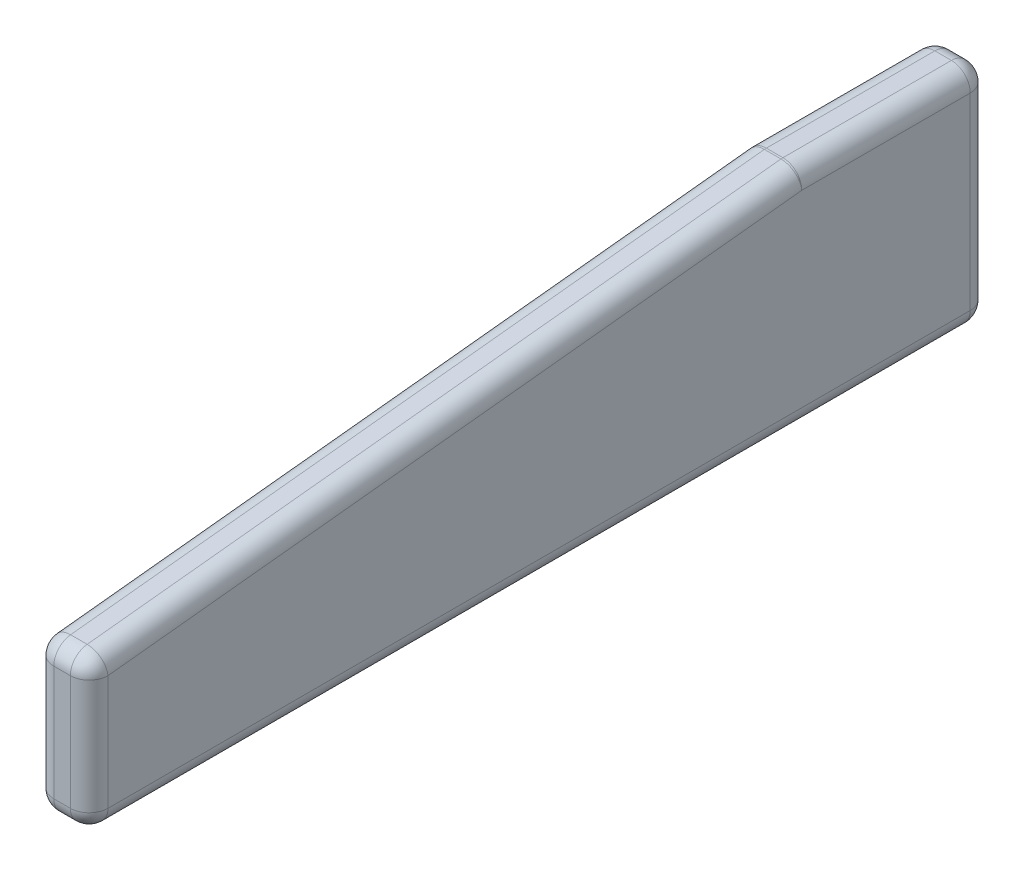
ISO-10303-21;
HEADER;
FILE_DESCRIPTION(('STEP AP214'),'2;1');
FILE_NAME('part.step','',(''),(''),'','','');
FILE_SCHEMA(('AUTOMOTIVE_DESIGN { 1 0 10303 214 1 1 1 1 }'));
ENDSEC;
DATA;
#1=APPLICATION_CONTEXT('core data for automotive mechanical design processes');
#2=APPLICATION_PROTOCOL_DEFINITION('international standard','automotive_design',2000,#1);
#3=PRODUCT_CONTEXT('',#1,'mechanical');
#4=PRODUCT('Part','Part','',(#3));
#5=PRODUCT_RELATED_PRODUCT_CATEGORY('part','',(#4));
#6=PRODUCT_DEFINITION_FORMATION('','',#4);
#7=PRODUCT_DEFINITION_CONTEXT('part definition',#1,'design');
#8=PRODUCT_DEFINITION('design','',#6,#7);
#9=PRODUCT_DEFINITION_SHAPE('','',#8);
#10=(LENGTH_UNIT() NAMED_UNIT(*) SI_UNIT(.MILLI.,.METRE.));
#11=(NAMED_UNIT(*) PLANE_ANGLE_UNIT() SI_UNIT($,.RADIAN.));
#12=(NAMED_UNIT(*) SI_UNIT($,.STERADIAN.) SOLID_ANGLE_UNIT());
#13=UNCERTAINTY_MEASURE_WITH_UNIT(LENGTH_MEASURE(1.E-05),#10,'distance_accuracy_value','');
#14=(GEOMETRIC_REPRESENTATION_CONTEXT(3) GLOBAL_UNCERTAINTY_ASSIGNED_CONTEXT((#13)) GLOBAL_UNIT_ASSIGNED_CONTEXT((#10,
#11,#12)) REPRESENTATION_CONTEXT('',''));
#15=CARTESIAN_POINT('',(0.,0.,0.));
#16=DIRECTION('',(0.,0.,1.));
#17=DIRECTION('',(1.,0.,0.));
#18=AXIS2_PLACEMENT_3D('',#15,#16,#17);
#19=CARTESIAN_POINT('',(18.288,12.2037693458045,-66.9711017356004));
#20=DIRECTION('',(-1.,0.,0.));
#21=DIRECTION('',(0.,0.,1.));
#22=AXIS2_PLACEMENT_3D('',#19,#20,#21);
#23=CYLINDRICAL_SURFACE('',#22,6.35);
#24=DIRECTION('',(-1.,0.,0.));
#25=VECTOR('',#24,1.);
#26=CARTESIAN_POINT('',(18.288,18.5537693458045,-66.9711017356004));
#27=LINE('',#26,#25);
#28=CARTESIAN_POINT('',(11.938,18.5537693458045,-66.9711017356004));
#29=VERTEX_POINT('',#28);
#30=CARTESIAN_POINT('',(6.35,18.5537693458045,-66.9711017356004));
#31=VERTEX_POINT('',#30);
#32=EDGE_CURVE('E147',#29,#31,#27,.T.);
#33=ORIENTED_EDGE('',*,*,#32,.T.);
#34=CARTESIAN_POINT('',(6.35,12.2037693458045,-66.9711017356004));
#35=DIRECTION('',(-1.,0.,0.));
#36=DIRECTION('',(0.,0.,1.));
#37=AXIS2_PLACEMENT_3D('',#34,#35,#36);
#38=CIRCLE('',#37,6.35);
#39=CARTESIAN_POINT('',(6.35,18.5184912950592,-66.3026806829688));
#40=VERTEX_POINT('',#39);
#41=EDGE_CURVE('E247',#31,#40,#38,.F.);
#42=ORIENTED_EDGE('',*,*,#41,.T.);
#43=DIRECTION('',(-1.,0.,0.));
#44=VECTOR('',#43,1.);
#45=CARTESIAN_POINT('',(18.288,18.5184912950592,-66.3026806829688));
#46=LINE('',#45,#44);
#47=CARTESIAN_POINT('',(11.938,18.5184912950592,-66.3026806829688));
#48=VERTEX_POINT('',#47);
#49=EDGE_CURVE('E170',#48,#40,#46,.T.);
#50=ORIENTED_EDGE('',*,*,#49,.F.);
#51=CARTESIAN_POINT('',(11.938,12.2037693458045,-66.9711017356004));
#52=DIRECTION('',(-1.,0.,0.));
#53=DIRECTION('',(0.,0.,1.));
#54=AXIS2_PLACEMENT_3D('',#51,#52,#53);
#55=CIRCLE('',#54,6.35);
#56=EDGE_CURVE('E237',#48,#29,#55,.T.);
#57=ORIENTED_EDGE('',*,*,#56,.T.);
#58=EDGE_LOOP('',(#33,#42,#50,#57));
#59=FACE_BOUND('',#58,.T.);
#60=ADVANCED_FACE('F34',(#59),#23,.T.);
#61=CARTESIAN_POINT('',(18.288,18.5184912950592,-66.3026806829688));
#62=DIRECTION('',(0.,-0.994444401457431,-0.105263157894737));
#63=DIRECTION('',(0.,0.105263157894737,-0.994444401457431));
#64=AXIS2_PLACEMENT_3D('',#61,#62,#63);
#65=PLANE('',#64);
#66=ORIENTED_EDGE('',*,*,#49,.T.);
#67=DIRECTION('',(0.,-0.105263157894737,0.994444401457431));
#68=VECTOR('',#67,1.);
#69=CARTESIAN_POINT('',(6.35,-6.24482856379033,167.64189487079));
#70=LINE('',#69,#68);
#71=CARTESIAN_POINT('',(6.35,-6.24482856379033,167.64189487079));
#72=VERTEX_POINT('',#71);
#73=EDGE_CURVE('E257',#40,#72,#70,.T.);
#74=ORIENTED_EDGE('',*,*,#73,.T.);
#75=DIRECTION('',(-1.,0.,0.));
#76=VECTOR('',#75,1.);
#77=CARTESIAN_POINT('',(18.288,-6.24482856379033,167.64189487079));
#78=LINE('',#77,#76);
#79=CARTESIAN_POINT('',(11.938,-6.24482856379033,167.64189487079));
#80=VERTEX_POINT('',#79);
#81=EDGE_CURVE('E299',#80,#72,#78,.T.);
#82=ORIENTED_EDGE('',*,*,#81,.F.);
#83=DIRECTION('',(0.,-0.105263157894737,0.994444401457431));
#84=VECTOR('',#83,1.);
#85=CARTESIAN_POINT('',(11.938,18.5184912950592,-66.3026806829688));
#86=LINE('',#85,#84);
#87=EDGE_CURVE('E259',#80,#48,#86,.F.);
#88=ORIENTED_EDGE('',*,*,#87,.T.);
#89=EDGE_LOOP('',(#66,#74,#82,#88));
#90=FACE_BOUND('',#89,.T.);
#91=ADVANCED_FACE('F349',(#90),#65,.F.);
#92=CARTESIAN_POINT('',(18.288,-12.559550513045,166.973473818158));
#93=DIRECTION('',(-1.,0.,0.));
#94=DIRECTION('',(0.,0.,1.));
#95=AXIS2_PLACEMENT_3D('',#92,#93,#94);
#96=CYLINDRICAL_SURFACE('',#95,6.35);
#97=ORIENTED_EDGE('',*,*,#81,.T.);
#98=CARTESIAN_POINT('',(6.35,-12.559550513045,166.973473818158));
#99=DIRECTION('',(-1.,0.,0.));
#100=DIRECTION('',(0.,0.,1.));
#101=AXIS2_PLACEMENT_3D('',#98,#99,#100);
#102=CIRCLE('',#101,6.35);
#103=CARTESIAN_POINT('',(6.35,-12.5595505130451,173.323473818158));
#104=VERTEX_POINT('',#103);
#105=EDGE_CURVE('E261',#72,#104,#102,.F.);
#106=ORIENTED_EDGE('',*,*,#105,.T.);
#107=DIRECTION('',(-1.,0.,0.));
#108=VECTOR('',#107,1.);
#109=CARTESIAN_POINT('',(18.288,-12.5595505130451,173.323473818158));
#110=LINE('',#109,#108);
#111=CARTESIAN_POINT('',(11.938,-12.5595505130451,173.323473818158));
#112=VERTEX_POINT('',#111);
#113=EDGE_CURVE('E302',#112,#104,#110,.T.);
#114=ORIENTED_EDGE('',*,*,#113,.F.);
#115=CARTESIAN_POINT('',(11.938,-12.559550513045,166.973473818158));
#116=DIRECTION('',(-1.,0.,0.));
#117=DIRECTION('',(0.,0.,1.));
#118=AXIS2_PLACEMENT_3D('',#115,#116,#117);
#119=CIRCLE('',#118,6.35);
#120=EDGE_CURVE('E263',#112,#80,#119,.T.);
#121=ORIENTED_EDGE('',*,*,#120,.T.);
#122=EDGE_LOOP('',(#97,#106,#114,#121));
#123=FACE_BOUND('',#122,.T.);
#124=ADVANCED_FACE('F353',(#123),#96,.T.);
#125=CARTESIAN_POINT('',(18.288,-12.5595505130451,173.323473818158));
#126=DIRECTION('',(0.,0.,-1.));
#127=DIRECTION('',(-1.,0.,0.));
#128=AXIS2_PLACEMENT_3D('',#125,#126,#127);
#129=PLANE('',#128);
#130=ORIENTED_EDGE('',*,*,#113,.T.);
#131=DIRECTION('',(0.,-1.,0.));
#132=VECTOR('',#131,1.);
#133=CARTESIAN_POINT('',(6.35,-51.2962306541955,173.323473818158));
#134=LINE('',#133,#132);
#135=CARTESIAN_POINT('',(6.35,-51.2962306541955,173.323473818158));
#136=VERTEX_POINT('',#135);
#137=EDGE_CURVE('E265',#104,#136,#134,.T.);
#138=ORIENTED_EDGE('',*,*,#137,.T.);
#139=DIRECTION('',(-1.,0.,0.));
#140=VECTOR('',#139,1.);
#141=CARTESIAN_POINT('',(18.288,-51.2962306541955,173.323473818158));
#142=LINE('',#141,#140);
#143=CARTESIAN_POINT('',(11.938,-51.2962306541955,173.323473818158));
#144=VERTEX_POINT('',#143);
#145=EDGE_CURVE('E305',#144,#136,#142,.T.);
#146=ORIENTED_EDGE('',*,*,#145,.F.);
#147=DIRECTION('',(0.,-1.,0.));
#148=VECTOR('',#147,1.);
#149=CARTESIAN_POINT('',(11.938,-12.5595505130451,173.323473818158));
#150=LINE('',#149,#148);
#151=EDGE_CURVE('E267',#144,#112,#150,.F.);
#152=ORIENTED_EDGE('',*,*,#151,.T.);
#153=EDGE_LOOP('',(#130,#138,#146,#152));
#154=FACE_BOUND('',#153,.T.);
#155=ADVANCED_FACE('F359',(#154),#129,.F.);
#156=CARTESIAN_POINT('',(18.288,-51.2962306541955,166.973473818158));
#157=DIRECTION('',(-1.,0.,0.));
#158=DIRECTION('',(0.,0.,1.));
#159=AXIS2_PLACEMENT_3D('',#156,#157,#158);
#160=CYLINDRICAL_SURFACE('',#159,6.35);
#161=ORIENTED_EDGE('',*,*,#145,.T.);
#162=CARTESIAN_POINT('',(6.35,-51.2962306541955,166.973473818158));
#163=DIRECTION('',(-1.,0.,0.));
#164=DIRECTION('',(0.,0.,1.));
#165=AXIS2_PLACEMENT_3D('',#162,#163,#164);
#166=CIRCLE('',#165,6.35);
#167=CARTESIAN_POINT('',(6.35,-57.6462306541955,166.973473818158));
#168=VERTEX_POINT('',#167);
#169=EDGE_CURVE('E269',#136,#168,#166,.F.);
#170=ORIENTED_EDGE('',*,*,#169,.T.);
#171=DIRECTION('',(-1.,0.,0.));
#172=VECTOR('',#171,1.);
#173=CARTESIAN_POINT('',(18.288,-57.6462306541955,166.973473818158));
#174=LINE('',#173,#172);
#175=CARTESIAN_POINT('',(11.938,-57.6462306541955,166.973473818158));
#176=VERTEX_POINT('',#175);
#177=EDGE_CURVE('E308',#176,#168,#174,.T.);
#178=ORIENTED_EDGE('',*,*,#177,.F.);
#179=CARTESIAN_POINT('',(11.938,-51.2962306541955,166.973473818158));
#180=DIRECTION('',(-1.,0.,0.));
#181=DIRECTION('',(0.,0.,1.));
#182=AXIS2_PLACEMENT_3D('',#179,#180,#181);
#183=CIRCLE('',#182,6.35);
#184=EDGE_CURVE('E271',#176,#144,#183,.T.);
#185=ORIENTED_EDGE('',*,*,#184,.T.);
#186=EDGE_LOOP('',(#161,#170,#178,#185));
#187=FACE_BOUND('',#186,.T.);
#188=ADVANCED_FACE('F363',(#187),#160,.T.);
#189=CARTESIAN_POINT('',(18.288,-57.6462306541955,166.973473818158));
#190=DIRECTION('',(0.,1.,0.));
#191=DIRECTION('',(0.,0.,1.));
#192=AXIS2_PLACEMENT_3D('',#189,#190,#191);
#193=PLANE('',#192);
#194=ORIENTED_EDGE('',*,*,#177,.T.);
#195=DIRECTION('',(0.,0.,-1.));
#196=VECTOR('',#195,1.);
#197=CARTESIAN_POINT('',(6.35,-57.6462306541955,-123.78596025352));
#198=LINE('',#197,#196);
#199=CARTESIAN_POINT('',(6.35,-57.6462306541955,-123.78596025352));
#200=VERTEX_POINT('',#199);
#201=EDGE_CURVE('E273',#168,#200,#198,.T.);
#202=ORIENTED_EDGE('',*,*,#201,.T.);
#203=DIRECTION('',(-1.,0.,0.));
#204=VECTOR('',#203,1.);
#205=CARTESIAN_POINT('',(18.288,-57.6462306541955,-123.78596025352));
#206=LINE('',#205,#204);
#207=CARTESIAN_POINT('',(11.938,-57.6462306541955,-123.78596025352));
#208=VERTEX_POINT('',#207);
#209=EDGE_CURVE('E311',#208,#200,#206,.T.);
#210=ORIENTED_EDGE('',*,*,#209,.F.);
#211=DIRECTION('',(0.,0.,-1.));
#212=VECTOR('',#211,1.);
#213=CARTESIAN_POINT('',(11.938,-57.6462306541955,166.973473818158));
#214=LINE('',#213,#212);
#215=EDGE_CURVE('E275',#208,#176,#214,.F.);
#216=ORIENTED_EDGE('',*,*,#215,.T.);
#217=EDGE_LOOP('',(#194,#202,#210,#216));
#218=FACE_BOUND('',#217,.T.);
#219=ADVANCED_FACE('F367',(#218),#193,.F.);
#220=CARTESIAN_POINT('',(18.288,-51.2962306541955,-123.78596025352));
#221=DIRECTION('',(-1.,0.,0.));
#222=DIRECTION('',(0.,0.,1.));
#223=AXIS2_PLACEMENT_3D('',#220,#221,#222);
#224=CYLINDRICAL_SURFACE('',#223,6.34999999999999);
#225=ORIENTED_EDGE('',*,*,#209,.T.);
#226=CARTESIAN_POINT('',(6.35,-51.2962306541955,-123.78596025352));
#227=DIRECTION('',(-1.,0.,0.));
#228=DIRECTION('',(0.,0.,1.));
#229=AXIS2_PLACEMENT_3D('',#226,#227,#228);
#230=CIRCLE('',#229,6.34999999999999);
#231=CARTESIAN_POINT('',(6.35,-51.2962306541954,-130.13596025352));
#232=VERTEX_POINT('',#231);
#233=EDGE_CURVE('E277',#200,#232,#230,.F.);
#234=ORIENTED_EDGE('',*,*,#233,.T.);
#235=DIRECTION('',(-1.,0.,0.));
#236=VECTOR('',#235,1.);
#237=CARTESIAN_POINT('',(18.288,-51.2962306541954,-130.13596025352));
#238=LINE('',#237,#236);
#239=CARTESIAN_POINT('',(11.938,-51.2962306541954,-130.13596025352));
#240=VERTEX_POINT('',#239);
#241=EDGE_CURVE('E314',#240,#232,#238,.T.);
#242=ORIENTED_EDGE('',*,*,#241,.F.);
#243=CARTESIAN_POINT('',(11.938,-51.2962306541955,-123.78596025352));
#244=DIRECTION('',(-1.,0.,0.));
#245=DIRECTION('',(0.,0.,1.));
#246=AXIS2_PLACEMENT_3D('',#243,#244,#245);
#247=CIRCLE('',#246,6.34999999999999);
#248=EDGE_CURVE('E279',#240,#208,#247,.T.);
#249=ORIENTED_EDGE('',*,*,#248,.T.);
#250=EDGE_LOOP('',(#225,#234,#242,#249));
#251=FACE_BOUND('',#250,.T.);
#252=ADVANCED_FACE('F371',(#251),#224,.T.);
#253=CARTESIAN_POINT('',(18.288,-51.2962306541954,-130.13596025352));
#254=DIRECTION('',(0.,0.,1.));
#255=DIRECTION('',(1.,0.,0.));
#256=AXIS2_PLACEMENT_3D('',#253,#254,#255);
#257=PLANE('',#256);
#258=ORIENTED_EDGE('',*,*,#241,.T.);
#259=DIRECTION('',(0.,1.,0.));
#260=VECTOR('',#259,1.);
#261=CARTESIAN_POINT('',(6.35,12.2037693458045,-130.13596025352));
#262=LINE('',#261,#260);
#263=CARTESIAN_POINT('',(6.35,12.2037693458045,-130.13596025352));
#264=VERTEX_POINT('',#263);
#265=EDGE_CURVE('E292',#232,#264,#262,.T.);
#266=ORIENTED_EDGE('',*,*,#265,.T.);
#267=DIRECTION('',(-1.,0.,0.));
#268=VECTOR('',#267,1.);
#269=CARTESIAN_POINT('',(18.288,12.2037693458045,-130.13596025352));
#270=LINE('',#269,#268);
#271=CARTESIAN_POINT('',(11.938,12.2037693458045,-130.13596025352));
#272=VERTEX_POINT('',#271);
#273=EDGE_CURVE('E161',#272,#264,#270,.T.);
#274=ORIENTED_EDGE('',*,*,#273,.F.);
#275=DIRECTION('',(0.,1.,0.));
#276=VECTOR('',#275,1.);
#277=CARTESIAN_POINT('',(11.938,-51.2962306541954,-130.13596025352));
#278=LINE('',#277,#276);
#279=EDGE_CURVE('E294',#272,#240,#278,.F.);
#280=ORIENTED_EDGE('',*,*,#279,.T.);
#281=EDGE_LOOP('',(#258,#266,#274,#280));
#282=FACE_BOUND('',#281,.T.);
#283=ADVANCED_FACE('F375',(#282),#257,.F.);
#284=CARTESIAN_POINT('',(18.288,12.2037693458045,-123.78596025352));
#285=DIRECTION('',(-1.,0.,0.));
#286=DIRECTION('',(0.,0.,1.));
#287=AXIS2_PLACEMENT_3D('',#284,#285,#286);
#288=CYLINDRICAL_SURFACE('',#287,6.35);
#289=ORIENTED_EDGE('',*,*,#273,.T.);
#290=CARTESIAN_POINT('',(6.35,12.2037693458045,-123.78596025352));
#291=DIRECTION('',(-1.,0.,0.));
#292=DIRECTION('',(0.,0.,1.));
#293=AXIS2_PLACEMENT_3D('',#290,#291,#292);
#294=CIRCLE('',#293,6.35);
#295=CARTESIAN_POINT('',(6.35,18.5537693458045,-123.78596025352));
#296=VERTEX_POINT('',#295);
#297=EDGE_CURVE('E160',#264,#296,#294,.F.);
#298=ORIENTED_EDGE('',*,*,#297,.T.);
#299=DIRECTION('',(-1.,0.,0.));
#300=VECTOR('',#299,1.);
#301=CARTESIAN_POINT('',(18.288,18.5537693458045,-123.78596025352));
#302=LINE('',#301,#300);
#303=CARTESIAN_POINT('',(11.938,18.5537693458045,-123.78596025352));
#304=VERTEX_POINT('',#303);
#305=EDGE_CURVE('E145',#304,#296,#302,.T.);
#306=ORIENTED_EDGE('',*,*,#305,.F.);
#307=CARTESIAN_POINT('',(11.938,12.2037693458045,-123.78596025352));
#308=DIRECTION('',(-1.,0.,0.));
#309=DIRECTION('',(0.,0.,1.));
#310=AXIS2_PLACEMENT_3D('',#307,#308,#309);
#311=CIRCLE('',#310,6.35);
#312=EDGE_CURVE('E157',#304,#272,#311,.T.);
#313=ORIENTED_EDGE('',*,*,#312,.T.);
#314=EDGE_LOOP('',(#289,#298,#306,#313));
#315=FACE_BOUND('',#314,.T.);
#316=ADVANCED_FACE('F156',(#315),#288,.T.);
#317=CARTESIAN_POINT('',(18.288,18.5537693458045,-123.78596025352));
#318=DIRECTION('',(0.,-1.,0.));
#319=DIRECTION('',(0.,0.,-1.));
#320=AXIS2_PLACEMENT_3D('',#317,#318,#319);
#321=PLANE('',#320);
#322=ORIENTED_EDGE('',*,*,#32,.F.);
#323=DIRECTION('',(0.,0.,1.));
#324=VECTOR('',#323,1.);
#325=CARTESIAN_POINT('',(11.938,18.5537693458045,-123.78596025352));
#326=LINE('',#325,#324);
#327=EDGE_CURVE('E11',#29,#304,#326,.F.);
#328=ORIENTED_EDGE('',*,*,#327,.T.);
#329=ORIENTED_EDGE('',*,*,#305,.T.);
#330=DIRECTION('',(0.,0.,1.));
#331=VECTOR('',#330,1.);
#332=CARTESIAN_POINT('',(6.35,18.5537693458045,-66.9711017356004));
#333=LINE('',#332,#331);
#334=EDGE_CURVE('E43',#296,#31,#333,.T.);
#335=ORIENTED_EDGE('',*,*,#334,.T.);
#336=EDGE_LOOP('',(#322,#328,#329,#335));
#337=FACE_BOUND('',#336,.T.);
#338=ADVANCED_FACE('F144',(#337),#321,.F.);
#339=CARTESIAN_POINT('',(18.288,12.2037693458045,-66.9711017356004));
#340=DIRECTION('',(-1.,0.,0.));
#341=DIRECTION('',(0.,0.,1.));
#342=AXIS2_PLACEMENT_3D('',#339,#340,#341);
#343=PLANE('',#342);
#344=DIRECTION('',(0.,1.,0.));
#345=VECTOR('',#344,1.);
#346=CARTESIAN_POINT('',(18.288,12.2037693458045,-123.78596025352));
#347=LINE('',#346,#345);
#348=CARTESIAN_POINT('',(18.288,-51.2962306541955,-123.78596025352));
#349=VERTEX_POINT('',#348);
#350=CARTESIAN_POINT('',(18.288,12.2037693458045,-123.78596025352));
#351=VERTEX_POINT('',#350);
#352=EDGE_CURVE('E51',#349,#351,#347,.T.);
#353=ORIENTED_EDGE('',*,*,#352,.T.);
#354=DIRECTION('',(0.,0.,1.));
#355=VECTOR('',#354,1.);
#356=CARTESIAN_POINT('',(18.288,12.2037693458045,-66.9711017356004));
#357=LINE('',#356,#355);
#358=CARTESIAN_POINT('',(18.288,12.2037693458045,-66.9711017356004));
#359=VERTEX_POINT('',#358);
#360=EDGE_CURVE('E173',#351,#359,#357,.T.);
#361=ORIENTED_EDGE('',*,*,#360,.T.);
#362=DIRECTION('',(0.,-0.105263157894737,0.994444401457431));
#363=VECTOR('',#362,1.);
#364=CARTESIAN_POINT('',(18.288,12.2037693458045,-66.9711017356004));
#365=LINE('',#364,#363);
#366=CARTESIAN_POINT('',(18.288,-12.559550513045,166.973473818158));
#367=VERTEX_POINT('',#366);
#368=EDGE_CURVE('E241',#359,#367,#365,.T.);
#369=ORIENTED_EDGE('',*,*,#368,.T.);
#370=DIRECTION('',(0.,-1.,0.));
#371=VECTOR('',#370,1.);
#372=CARTESIAN_POINT('',(18.288,12.2037693458045,166.973473818158));
#373=LINE('',#372,#371);
#374=CARTESIAN_POINT('',(18.288,-51.2962306541955,166.973473818158));
#375=VERTEX_POINT('',#374);
#376=EDGE_CURVE('E246',#367,#375,#373,.T.);
#377=ORIENTED_EDGE('',*,*,#376,.T.);
#378=DIRECTION('',(0.,0.,-1.));
#379=VECTOR('',#378,1.);
#380=CARTESIAN_POINT('',(18.288,-51.2962306541955,-66.9711017356004));
#381=LINE('',#380,#379);
#382=EDGE_CURVE('E56',#375,#349,#381,.T.);
#383=ORIENTED_EDGE('',*,*,#382,.T.);
#384=EDGE_LOOP('',(#353,#361,#369,#377,#383));
#385=FACE_BOUND('',#384,.T.);
#386=ADVANCED_FACE('F249',(#385),#343,.F.);
#387=CARTESIAN_POINT('',(0.,12.2037693458045,-66.9711017356004));
#388=DIRECTION('',(-1.,0.,0.));
#389=DIRECTION('',(0.,0.,1.));
#390=AXIS2_PLACEMENT_3D('',#387,#388,#389);
#391=PLANE('',#390);
#392=DIRECTION('',(0.,0.,1.));
#393=VECTOR('',#392,1.);
#394=CARTESIAN_POINT('',(0.,12.2037693458045,-123.78596025352));
#395=LINE('',#394,#393);
#396=CARTESIAN_POINT('',(0.,12.2037693458045,-66.9711017356004));
#397=VERTEX_POINT('',#396);
#398=CARTESIAN_POINT('',(0.,12.2037693458045,-123.78596025352));
#399=VERTEX_POINT('',#398);
#400=EDGE_CURVE('E290',#397,#399,#395,.F.);
#401=ORIENTED_EDGE('',*,*,#400,.T.);
#402=DIRECTION('',(0.,1.,0.));
#403=VECTOR('',#402,1.);
#404=CARTESIAN_POINT('',(0.,-51.2962306541954,-123.78596025352));
#405=LINE('',#404,#403);
#406=CARTESIAN_POINT('',(0.,-51.2962306541955,-123.78596025352));
#407=VERTEX_POINT('',#406);
#408=EDGE_CURVE('E281',#399,#407,#405,.F.);
#409=ORIENTED_EDGE('',*,*,#408,.T.);
#410=DIRECTION('',(0.,0.,-1.));
#411=VECTOR('',#410,1.);
#412=CARTESIAN_POINT('',(0.,-51.2962306541955,166.973473818158));
#413=LINE('',#412,#411);
#414=CARTESIAN_POINT('',(0.,-51.2962306541955,166.973473818158));
#415=VERTEX_POINT('',#414);
#416=EDGE_CURVE('E284',#407,#415,#413,.F.);
#417=ORIENTED_EDGE('',*,*,#416,.T.);
#418=DIRECTION('',(0.,-1.,0.));
#419=VECTOR('',#418,1.);
#420=CARTESIAN_POINT('',(0.,-12.5595505130451,166.973473818158));
#421=LINE('',#420,#419);
#422=CARTESIAN_POINT('',(0.,-12.559550513045,166.973473818158));
#423=VERTEX_POINT('',#422);
#424=EDGE_CURVE('E286',#415,#423,#421,.F.);
#425=ORIENTED_EDGE('',*,*,#424,.T.);
#426=DIRECTION('',(0.,-0.105263157894737,0.994444401457431));
#427=VECTOR('',#426,1.);
#428=CARTESIAN_POINT('',(0.,12.2037693458045,-66.9711017356003));
#429=LINE('',#428,#427);
#430=EDGE_CURVE('E288',#423,#397,#429,.F.);
#431=ORIENTED_EDGE('',*,*,#430,.T.);
#432=EDGE_LOOP('',(#401,#409,#417,#425,#431));
#433=FACE_BOUND('',#432,.T.);
#434=ADVANCED_FACE('F330',(#433),#391,.T.);
#435=CARTESIAN_POINT('',(6.35,-12.5595505130451,166.973473818158));
#436=DIRECTION('',(0.,1.,0.));
#437=DIRECTION('',(0.,0.,1.));
#438=AXIS2_PLACEMENT_3D('',#435,#436,#437);
#439=CYLINDRICAL_SURFACE('',#438,6.35);
#440=CARTESIAN_POINT('',(6.35,-51.2962306541955,166.973473818158));
#441=DIRECTION('',(0.,-1.,0.));
#442=DIRECTION('',(1.,0.,0.));
#443=AXIS2_PLACEMENT_3D('',#440,#441,#442);
#444=CIRCLE('',#443,6.35);
#445=EDGE_CURVE('E230',#136,#415,#444,.T.);
#446=ORIENTED_EDGE('',*,*,#445,.F.);
#447=ORIENTED_EDGE('',*,*,#137,.F.);
#448=CARTESIAN_POINT('',(6.35,-12.5595505130451,166.973473818158));
#449=DIRECTION('',(0.,1.,0.));
#450=DIRECTION('',(0.,0.,1.));
#451=AXIS2_PLACEMENT_3D('',#448,#449,#450);
#452=CIRCLE('',#451,6.35);
#453=EDGE_CURVE('E227',#423,#104,#452,.T.);
#454=ORIENTED_EDGE('',*,*,#453,.F.);
#455=ORIENTED_EDGE('',*,*,#424,.F.);
#456=EDGE_LOOP('',(#446,#447,#454,#455));
#457=FACE_BOUND('',#456,.T.);
#458=ADVANCED_FACE('F386',(#457),#439,.T.);
#459=CARTESIAN_POINT('',(6.35,-51.2962306541955,166.973473818158));
#460=DIRECTION('',(0.,0.,1.));
#461=DIRECTION('',(1.,0.,0.));
#462=AXIS2_PLACEMENT_3D('',#459,#460,#461);
#463=SPHERICAL_SURFACE('',#462,6.35);
#464=ORIENTED_EDGE('',*,*,#169,.F.);
#465=ORIENTED_EDGE('',*,*,#445,.T.);
#466=CARTESIAN_POINT('',(6.35,-51.2962306541955,166.973473818158));
#467=DIRECTION('',(0.,0.,-1.));
#468=DIRECTION('',(0.,1.,0.));
#469=AXIS2_PLACEMENT_3D('',#466,#467,#468);
#470=CIRCLE('',#469,6.35);
#471=EDGE_CURVE('E224',#168,#415,#470,.T.);
#472=ORIENTED_EDGE('',*,*,#471,.F.);
#473=EDGE_LOOP('',(#464,#465,#472));
#474=FACE_BOUND('',#473,.T.);
#475=ADVANCED_FACE('F402',(#474),#463,.T.);
#476=CARTESIAN_POINT('',(6.35,-12.559550513045,166.973473818158));
#477=DIRECTION('',(0.,0.,1.));
#478=DIRECTION('',(1.,0.,0.));
#479=AXIS2_PLACEMENT_3D('',#476,#477,#478);
#480=SPHERICAL_SURFACE('',#479,6.35);
#481=ORIENTED_EDGE('',*,*,#453,.T.);
#482=ORIENTED_EDGE('',*,*,#105,.F.);
#483=CARTESIAN_POINT('',(6.35,-12.559550513045,166.973473818158));
#484=DIRECTION('',(0.,0.105263157894731,-0.994444401457431));
#485=DIRECTION('',(0.,0.994444401457431,0.105263157894731));
#486=AXIS2_PLACEMENT_3D('',#483,#484,#485);
#487=CIRCLE('',#486,6.35);
#488=EDGE_CURVE('E221',#423,#72,#487,.T.);
#489=ORIENTED_EDGE('',*,*,#488,.F.);
#490=EDGE_LOOP('',(#481,#482,#489));
#491=FACE_BOUND('',#490,.T.);
#492=ADVANCED_FACE('F411',(#491),#480,.T.);
#493=CARTESIAN_POINT('',(6.35,-51.2962306541955,166.973473818158));
#494=DIRECTION('',(0.,0.,1.));
#495=DIRECTION('',(0.,-1.,0.));
#496=AXIS2_PLACEMENT_3D('',#493,#494,#495);
#497=CYLINDRICAL_SURFACE('',#496,6.35);
#498=ORIENTED_EDGE('',*,*,#471,.T.);
#499=ORIENTED_EDGE('',*,*,#416,.F.);
#500=CARTESIAN_POINT('',(6.35,-51.2962306541955,-123.78596025352));
#501=DIRECTION('',(0.,0.,-1.));
#502=DIRECTION('',(-1.,0.,0.));
#503=AXIS2_PLACEMENT_3D('',#500,#501,#502);
#504=CIRCLE('',#503,6.35);
#505=EDGE_CURVE('E218',#200,#407,#504,.T.);
#506=ORIENTED_EDGE('',*,*,#505,.F.);
#507=ORIENTED_EDGE('',*,*,#201,.F.);
#508=EDGE_LOOP('',(#498,#499,#506,#507));
#509=FACE_BOUND('',#508,.T.);
#510=ADVANCED_FACE('F419',(#509),#497,.T.);
#511=CARTESIAN_POINT('',(6.35,12.2037693458045,-66.9711017356003));
#512=DIRECTION('',(0.,0.105263157894737,-0.994444401457431));
#513=DIRECTION('',(0.,0.994444401457431,0.105263157894737));
#514=AXIS2_PLACEMENT_3D('',#511,#512,#513);
#515=CYLINDRICAL_SURFACE('',#514,6.35);
#516=ORIENTED_EDGE('',*,*,#488,.T.);
#517=ORIENTED_EDGE('',*,*,#73,.F.);
#518=CARTESIAN_POINT('',(6.35,12.2037693458045,-66.9711017356003));
#519=DIRECTION('',(0.,0.105263157894737,-0.994444401457431));
#520=DIRECTION('',(0.,0.994444401457431,0.105263157894737));
#521=AXIS2_PLACEMENT_3D('',#518,#519,#520);
#522=CIRCLE('',#521,6.35);
#523=EDGE_CURVE('E215',#397,#40,#522,.T.);
#524=ORIENTED_EDGE('',*,*,#523,.F.);
#525=ORIENTED_EDGE('',*,*,#430,.F.);
#526=EDGE_LOOP('',(#516,#517,#524,#525));
#527=FACE_BOUND('',#526,.T.);
#528=ADVANCED_FACE('F428',(#527),#515,.T.);
#529=CARTESIAN_POINT('',(6.35,-51.2962306541955,-123.78596025352));
#530=DIRECTION('',(0.,0.,1.));
#531=DIRECTION('',(1.,0.,0.));
#532=AXIS2_PLACEMENT_3D('',#529,#530,#531);
#533=SPHERICAL_SURFACE('',#532,6.35);
#534=ORIENTED_EDGE('',*,*,#233,.F.);
#535=ORIENTED_EDGE('',*,*,#505,.T.);
#536=CARTESIAN_POINT('',(6.35,-51.2962306541955,-123.78596025352));
#537=DIRECTION('',(0.,1.,0.));
#538=DIRECTION('',(0.,0.,1.));
#539=AXIS2_PLACEMENT_3D('',#536,#537,#538);
#540=CIRCLE('',#539,6.35);
#541=EDGE_CURVE('E213',#232,#407,#540,.T.);
#542=ORIENTED_EDGE('',*,*,#541,.F.);
#543=EDGE_LOOP('',(#534,#535,#542));
#544=FACE_BOUND('',#543,.T.);
#545=ADVANCED_FACE('F438',(#544),#533,.T.);
#546=CARTESIAN_POINT('',(6.35,12.2037693458045,-66.9711017356004));
#547=DIRECTION('',(0.,0.,1.));
#548=DIRECTION('',(1.,0.,0.));
#549=AXIS2_PLACEMENT_3D('',#546,#547,#548);
#550=SPHERICAL_SURFACE('',#549,6.35);
#551=ORIENTED_EDGE('',*,*,#523,.T.);
#552=ORIENTED_EDGE('',*,*,#41,.F.);
#553=CARTESIAN_POINT('',(6.35,12.2037693458045,-66.9711017356004));
#554=DIRECTION('',(0.,0.,-1.));
#555=DIRECTION('',(0.,1.,0.));
#556=AXIS2_PLACEMENT_3D('',#553,#554,#555);
#557=CIRCLE('',#556,6.35);
#558=EDGE_CURVE('E207',#397,#31,#557,.T.);
#559=ORIENTED_EDGE('',*,*,#558,.F.);
#560=EDGE_LOOP('',(#551,#552,#559));
#561=FACE_BOUND('',#560,.T.);
#562=ADVANCED_FACE('F323',(#561),#550,.T.);
#563=CARTESIAN_POINT('',(6.35,-51.2962306541954,-123.78596025352));
#564=DIRECTION('',(0.,-1.,0.));
#565=DIRECTION('',(0.,0.,-1.));
#566=AXIS2_PLACEMENT_3D('',#563,#564,#565);
#567=CYLINDRICAL_SURFACE('',#566,6.35);
#568=ORIENTED_EDGE('',*,*,#541,.T.);
#569=ORIENTED_EDGE('',*,*,#408,.F.);
#570=CARTESIAN_POINT('',(6.35,12.2037693458045,-123.78596025352));
#571=DIRECTION('',(0.,1.,0.));
#572=DIRECTION('',(-1.,0.,0.));
#573=AXIS2_PLACEMENT_3D('',#570,#571,#572);
#574=CIRCLE('',#573,6.35);
#575=EDGE_CURVE('E201',#264,#399,#574,.T.);
#576=ORIENTED_EDGE('',*,*,#575,.F.);
#577=ORIENTED_EDGE('',*,*,#265,.F.);
#578=EDGE_LOOP('',(#568,#569,#576,#577));
#579=FACE_BOUND('',#578,.T.);
#580=ADVANCED_FACE('F334',(#579),#567,.T.);
#581=CARTESIAN_POINT('',(6.35,12.2037693458045,-123.78596025352));
#582=DIRECTION('',(0.,0.,-1.));
#583=DIRECTION('',(0.,1.,0.));
#584=AXIS2_PLACEMENT_3D('',#581,#582,#583);
#585=CYLINDRICAL_SURFACE('',#584,6.35);
#586=ORIENTED_EDGE('',*,*,#558,.T.);
#587=ORIENTED_EDGE('',*,*,#334,.F.);
#588=CARTESIAN_POINT('',(6.35,12.2037693458045,-123.78596025352));
#589=DIRECTION('',(0.,0.,-1.));
#590=DIRECTION('',(0.,1.,0.));
#591=AXIS2_PLACEMENT_3D('',#588,#589,#590);
#592=CIRCLE('',#591,6.35);
#593=EDGE_CURVE('E197',#399,#296,#592,.T.);
#594=ORIENTED_EDGE('',*,*,#593,.F.);
#595=ORIENTED_EDGE('',*,*,#400,.F.);
#596=EDGE_LOOP('',(#586,#587,#594,#595));
#597=FACE_BOUND('',#596,.T.);
#598=ADVANCED_FACE('F327',(#597),#585,.T.);
#599=CARTESIAN_POINT('',(6.35,12.2037693458045,-123.78596025352));
#600=DIRECTION('',(0.,0.,1.));
#601=DIRECTION('',(1.,0.,0.));
#602=AXIS2_PLACEMENT_3D('',#599,#600,#601);
#603=SPHERICAL_SURFACE('',#602,6.35);
#604=ORIENTED_EDGE('',*,*,#297,.F.);
#605=ORIENTED_EDGE('',*,*,#575,.T.);
#606=ORIENTED_EDGE('',*,*,#593,.T.);
#607=EDGE_LOOP('',(#604,#605,#606));
#608=FACE_BOUND('',#607,.T.);
#609=ADVANCED_FACE('F337',(#608),#603,.T.);
#610=CARTESIAN_POINT('',(11.938,-51.2962306541955,-66.9711017356004));
#611=DIRECTION('',(0.,0.,-1.));
#612=DIRECTION('',(0.,1.,0.));
#613=AXIS2_PLACEMENT_3D('',#610,#611,#612);
#614=CYLINDRICAL_SURFACE('',#613,6.35);
#615=CARTESIAN_POINT('',(11.938,-51.2962306541955,166.973473818158));
#616=DIRECTION('',(0.,0.,1.));
#617=DIRECTION('',(1.,0.,0.));
#618=AXIS2_PLACEMENT_3D('',#615,#616,#617);
#619=CIRCLE('',#618,6.35);
#620=EDGE_CURVE('E190',#176,#375,#619,.T.);
#621=ORIENTED_EDGE('',*,*,#620,.F.);
#622=ORIENTED_EDGE('',*,*,#215,.F.);
#623=CARTESIAN_POINT('',(11.938,-51.2962306541955,-123.78596025352));
#624=DIRECTION('',(0.,0.,-1.));
#625=DIRECTION('',(0.,1.,0.));
#626=AXIS2_PLACEMENT_3D('',#623,#624,#625);
#627=CIRCLE('',#626,6.35);
#628=EDGE_CURVE('E38',#349,#208,#627,.T.);
#629=ORIENTED_EDGE('',*,*,#628,.F.);
#630=ORIENTED_EDGE('',*,*,#382,.F.);
#631=EDGE_LOOP('',(#621,#622,#629,#630));
#632=FACE_BOUND('',#631,.T.);
#633=ADVANCED_FACE('F36',(#632),#614,.T.);
#634=CARTESIAN_POINT('',(11.938,-51.2962306541955,-123.78596025352));
#635=DIRECTION('',(0.,0.,1.));
#636=DIRECTION('',(1.,0.,0.));
#637=AXIS2_PLACEMENT_3D('',#634,#635,#636);
#638=SPHERICAL_SURFACE('',#637,6.35);
#639=ORIENTED_EDGE('',*,*,#628,.T.);
#640=ORIENTED_EDGE('',*,*,#248,.F.);
#641=CARTESIAN_POINT('',(11.938,-51.2962306541955,-123.78596025352));
#642=DIRECTION('',(0.,1.,0.));
#643=DIRECTION('',(0.,0.,1.));
#644=AXIS2_PLACEMENT_3D('',#641,#642,#643);
#645=CIRCLE('',#644,6.35);
#646=EDGE_CURVE('E188',#349,#240,#645,.T.);
#647=ORIENTED_EDGE('',*,*,#646,.F.);
#648=EDGE_LOOP('',(#639,#640,#647));
#649=FACE_BOUND('',#648,.T.);
#650=ADVANCED_FACE('F344',(#649),#638,.T.);
#651=CARTESIAN_POINT('',(11.938,-51.2962306541955,166.973473818158));
#652=DIRECTION('',(0.,0.,1.));
#653=DIRECTION('',(1.,0.,0.));
#654=AXIS2_PLACEMENT_3D('',#651,#652,#653);
#655=SPHERICAL_SURFACE('',#654,6.35);
#656=ORIENTED_EDGE('',*,*,#184,.F.);
#657=ORIENTED_EDGE('',*,*,#620,.T.);
#658=CARTESIAN_POINT('',(11.938,-51.2962306541955,166.973473818158));
#659=DIRECTION('',(0.,1.,0.));
#660=DIRECTION('',(0.,0.,1.));
#661=AXIS2_PLACEMENT_3D('',#658,#659,#660);
#662=CIRCLE('',#661,6.35);
#663=EDGE_CURVE('E185',#144,#375,#662,.T.);
#664=ORIENTED_EDGE('',*,*,#663,.F.);
#665=EDGE_LOOP('',(#656,#657,#664));
#666=FACE_BOUND('',#665,.T.);
#667=ADVANCED_FACE('F620',(#666),#655,.T.);
#668=CARTESIAN_POINT('',(11.938,12.2037693458045,-123.78596025352));
#669=DIRECTION('',(0.,1.,0.));
#670=DIRECTION('',(0.,0.,1.));
#671=AXIS2_PLACEMENT_3D('',#668,#669,#670);
#672=CYLINDRICAL_SURFACE('',#671,6.35);
#673=ORIENTED_EDGE('',*,*,#646,.T.);
#674=ORIENTED_EDGE('',*,*,#279,.F.);
#675=CARTESIAN_POINT('',(11.938,12.2037693458045,-123.78596025352));
#676=DIRECTION('',(0.,1.,0.));
#677=DIRECTION('',(0.,0.,1.));
#678=AXIS2_PLACEMENT_3D('',#675,#676,#677);
#679=CIRCLE('',#678,6.35);
#680=EDGE_CURVE('E169',#351,#272,#679,.T.);
#681=ORIENTED_EDGE('',*,*,#680,.F.);
#682=ORIENTED_EDGE('',*,*,#352,.F.);
#683=EDGE_LOOP('',(#673,#674,#681,#682));
#684=FACE_BOUND('',#683,.T.);
#685=ADVANCED_FACE('F627',(#684),#672,.T.);
#686=CARTESIAN_POINT('',(11.938,12.2037693458045,166.973473818158));
#687=DIRECTION('',(0.,-1.,0.));
#688=DIRECTION('',(0.,0.,-1.));
#689=AXIS2_PLACEMENT_3D('',#686,#687,#688);
#690=CYLINDRICAL_SURFACE('',#689,6.35);
#691=ORIENTED_EDGE('',*,*,#663,.T.);
#692=ORIENTED_EDGE('',*,*,#376,.F.);
#693=CARTESIAN_POINT('',(11.938,-12.5595505130451,166.973473818158));
#694=DIRECTION('',(0.,1.,0.));
#695=DIRECTION('',(0.,0.,1.));
#696=AXIS2_PLACEMENT_3D('',#693,#694,#695);
#697=CIRCLE('',#696,6.35);
#698=EDGE_CURVE('E174',#112,#367,#697,.T.);
#699=ORIENTED_EDGE('',*,*,#698,.F.);
#700=ORIENTED_EDGE('',*,*,#151,.F.);
#701=EDGE_LOOP('',(#691,#692,#699,#700));
#702=FACE_BOUND('',#701,.T.);
#703=ADVANCED_FACE('F635',(#702),#690,.T.);
#704=CARTESIAN_POINT('',(11.938,12.2037693458045,-123.78596025352));
#705=DIRECTION('',(0.,0.,1.));
#706=DIRECTION('',(1.,0.,0.));
#707=AXIS2_PLACEMENT_3D('',#704,#705,#706);
#708=SPHERICAL_SURFACE('',#707,6.35);
#709=ORIENTED_EDGE('',*,*,#680,.T.);
#710=ORIENTED_EDGE('',*,*,#312,.F.);
#711=CARTESIAN_POINT('',(11.938,12.2037693458045,-123.78596025352));
#712=DIRECTION('',(0.,0.,1.));
#713=DIRECTION('',(0.,-1.,0.));
#714=AXIS2_PLACEMENT_3D('',#711,#712,#713);
#715=CIRCLE('',#714,6.35);
#716=EDGE_CURVE('E167',#351,#304,#715,.T.);
#717=ORIENTED_EDGE('',*,*,#716,.F.);
#718=EDGE_LOOP('',(#709,#710,#717));
#719=FACE_BOUND('',#718,.T.);
#720=ADVANCED_FACE('F166',(#719),#708,.T.);
#721=CARTESIAN_POINT('',(11.938,-12.559550513045,166.973473818158));
#722=DIRECTION('',(0.,0.,1.));
#723=DIRECTION('',(1.,0.,0.));
#724=AXIS2_PLACEMENT_3D('',#721,#722,#723);
#725=SPHERICAL_SURFACE('',#724,6.35);
#726=ORIENTED_EDGE('',*,*,#120,.F.);
#727=ORIENTED_EDGE('',*,*,#698,.T.);
#728=CARTESIAN_POINT('',(11.938,-12.559550513045,166.973473818158));
#729=DIRECTION('',(0.,0.105263157894731,-0.994444401457431));
#730=DIRECTION('',(0.,0.994444401457432,0.105263157894731));
#731=AXIS2_PLACEMENT_3D('',#728,#729,#730);
#732=CIRCLE('',#731,6.35);
#733=EDGE_CURVE('E175',#80,#367,#732,.T.);
#734=ORIENTED_EDGE('',*,*,#733,.F.);
#735=EDGE_LOOP('',(#726,#727,#734));
#736=FACE_BOUND('',#735,.T.);
#737=ADVANCED_FACE('F473',(#736),#725,.T.);
#738=CARTESIAN_POINT('',(11.938,12.2037693458045,-66.9711017356004));
#739=DIRECTION('',(0.,0.,1.));
#740=DIRECTION('',(0.,-1.,0.));
#741=AXIS2_PLACEMENT_3D('',#738,#739,#740);
#742=CYLINDRICAL_SURFACE('',#741,6.35);
#743=ORIENTED_EDGE('',*,*,#716,.T.);
#744=ORIENTED_EDGE('',*,*,#327,.F.);
#745=CARTESIAN_POINT('',(11.938,12.2037693458045,-66.9711017356004));
#746=DIRECTION('',(0.,0.,1.));
#747=DIRECTION('',(0.,-1.,0.));
#748=AXIS2_PLACEMENT_3D('',#745,#746,#747);
#749=CIRCLE('',#748,6.35);
#750=EDGE_CURVE('E180',#359,#29,#749,.T.);
#751=ORIENTED_EDGE('',*,*,#750,.F.);
#752=ORIENTED_EDGE('',*,*,#360,.F.);
#753=EDGE_LOOP('',(#743,#744,#751,#752));
#754=FACE_BOUND('',#753,.T.);
#755=ADVANCED_FACE('F172',(#754),#742,.T.);
#756=CARTESIAN_POINT('',(11.938,12.2037693458045,-66.9711017356004));
#757=DIRECTION('',(0.,-0.105263157894737,0.994444401457431));
#758=DIRECTION('',(0.,-0.994444401457431,-0.105263157894737));
#759=AXIS2_PLACEMENT_3D('',#756,#757,#758);
#760=CYLINDRICAL_SURFACE('',#759,6.35);
#761=ORIENTED_EDGE('',*,*,#733,.T.);
#762=ORIENTED_EDGE('',*,*,#368,.F.);
#763=CARTESIAN_POINT('',(11.938,12.2037693458045,-66.9711017356003));
#764=DIRECTION('',(0.,0.105263157894737,-0.994444401457431));
#765=DIRECTION('',(0.,0.994444401457431,0.105263157894737));
#766=AXIS2_PLACEMENT_3D('',#763,#764,#765);
#767=CIRCLE('',#766,6.35);
#768=EDGE_CURVE('E233',#48,#359,#767,.T.);
#769=ORIENTED_EDGE('',*,*,#768,.F.);
#770=ORIENTED_EDGE('',*,*,#87,.F.);
#771=EDGE_LOOP('',(#761,#762,#769,#770));
#772=FACE_BOUND('',#771,.T.);
#773=ADVANCED_FACE('F242',(#772),#760,.T.);
#774=CARTESIAN_POINT('',(11.938,12.2037693458045,-66.9711017356004));
#775=DIRECTION('',(0.,0.,1.));
#776=DIRECTION('',(1.,0.,0.));
#777=AXIS2_PLACEMENT_3D('',#774,#775,#776);
#778=SPHERICAL_SURFACE('',#777,6.35);
#779=ORIENTED_EDGE('',*,*,#750,.T.);
#780=ORIENTED_EDGE('',*,*,#56,.F.);
#781=ORIENTED_EDGE('',*,*,#768,.T.);
#782=EDGE_LOOP('',(#779,#780,#781));
#783=FACE_BOUND('',#782,.T.);
#784=ADVANCED_FACE('F236',(#783),#778,.T.);
#785=CLOSED_SHELL('',(#60,#91,#124,#155,#188,#219,#252,#283,#316,#338,#386,#434,#458,#475,#492,
#510,#528,#545,#562,#580,#598,#609,#633,#650,#667,#685,#703,#720,#737,#755,#773,#784));
#786=MANIFOLD_SOLID_BREP('B2',#785);
#787=ADVANCED_BREP_SHAPE_REPRESENTATION('',(#18,#786),#14);
#788=SHAPE_DEFINITION_REPRESENTATION(#9,#787);
ENDSEC;
END-ISO-10303-21;
